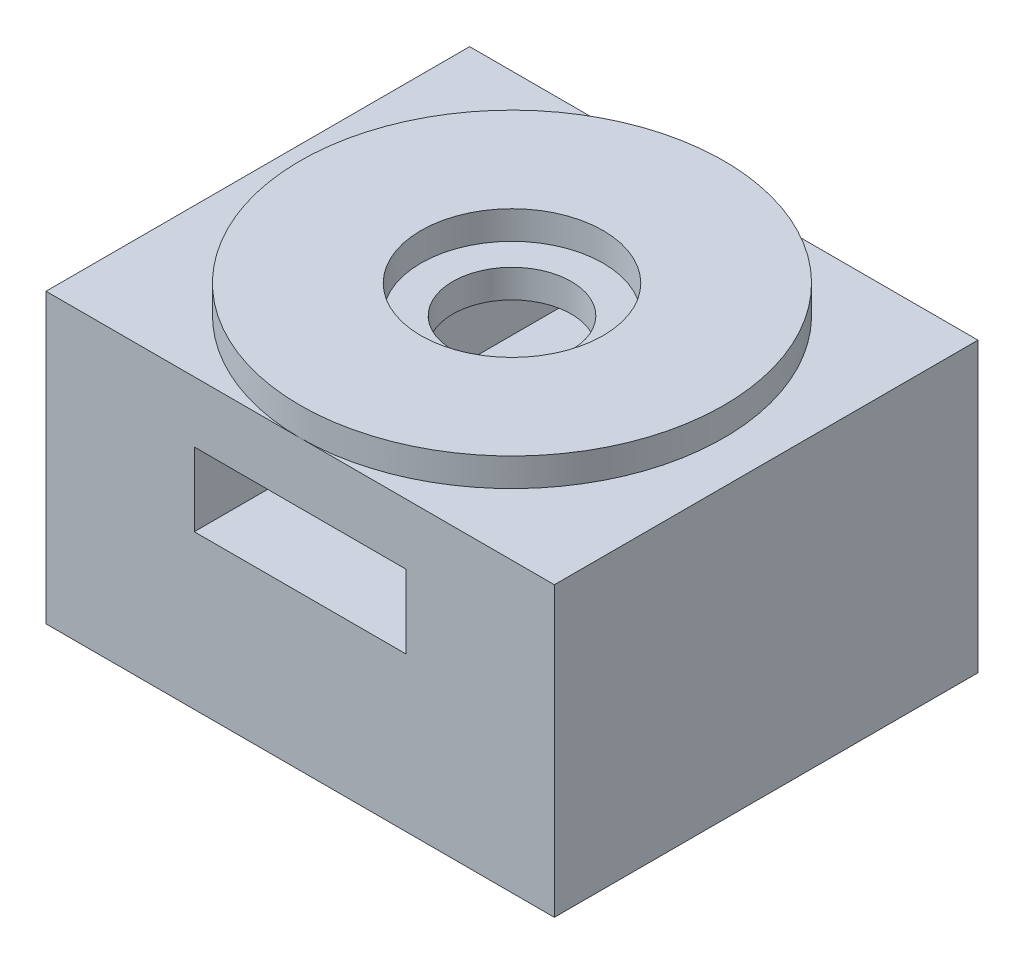
ISO-10303-21;
HEADER;
FILE_DESCRIPTION(('STEP AP214'),'2;1');
FILE_NAME('part.step','',(''),(''),'','','');
FILE_SCHEMA(('AUTOMOTIVE_DESIGN { 1 0 10303 214 1 1 1 1 }'));
ENDSEC;
DATA;
#1=APPLICATION_CONTEXT('core data for automotive mechanical design processes');
#2=APPLICATION_PROTOCOL_DEFINITION('international standard','automotive_design',2000,#1);
#3=PRODUCT_CONTEXT('',#1,'mechanical');
#4=PRODUCT('Part','Part','',(#3));
#5=PRODUCT_RELATED_PRODUCT_CATEGORY('part','',(#4));
#6=PRODUCT_DEFINITION_FORMATION('','',#4);
#7=PRODUCT_DEFINITION_CONTEXT('part definition',#1,'design');
#8=PRODUCT_DEFINITION('design','',#6,#7);
#9=PRODUCT_DEFINITION_SHAPE('','',#8);
#10=(LENGTH_UNIT() NAMED_UNIT(*) SI_UNIT(.MILLI.,.METRE.));
#11=(NAMED_UNIT(*) PLANE_ANGLE_UNIT() SI_UNIT($,.RADIAN.));
#12=(NAMED_UNIT(*) SI_UNIT($,.STERADIAN.) SOLID_ANGLE_UNIT());
#13=UNCERTAINTY_MEASURE_WITH_UNIT(LENGTH_MEASURE(1.E-05),#10,'distance_accuracy_value','');
#14=(GEOMETRIC_REPRESENTATION_CONTEXT(3) GLOBAL_UNCERTAINTY_ASSIGNED_CONTEXT((#13)) GLOBAL_UNIT_ASSIGNED_CONTEXT((#10,
#11,#12)) REPRESENTATION_CONTEXT('',''));
#15=CARTESIAN_POINT('',(0.,0.,0.));
#16=DIRECTION('',(0.,0.,1.));
#17=DIRECTION('',(1.,0.,0.));
#18=AXIS2_PLACEMENT_3D('',#15,#16,#17);
#19=CARTESIAN_POINT('',(-3.4,-15.003534722512,-3.6));
#20=DIRECTION('',(-1.,0.,0.));
#21=DIRECTION('',(0.,0.,1.));
#22=AXIS2_PLACEMENT_3D('',#19,#20,#21);
#23=PLANE('',#22);
#24=DIRECTION('',(0.,1.,0.));
#25=VECTOR('',#24,1.);
#26=CARTESIAN_POINT('',(-3.4,-15.003534722512,3.6));
#27=LINE('',#26,#25);
#28=CARTESIAN_POINT('',(-3.4,2.95,3.6));
#29=VERTEX_POINT('',#28);
#30=CARTESIAN_POINT('',(-3.4,4.1,3.6));
#31=VERTEX_POINT('',#30);
#32=EDGE_CURVE('E387',#29,#31,#27,.T.);
#33=ORIENTED_EDGE('',*,*,#32,.F.);
#34=DIRECTION('',(0.,0.,-1.));
#35=VECTOR('',#34,1.);
#36=CARTESIAN_POINT('',(-3.4,2.95,-3.6));
#37=LINE('',#36,#35);
#38=CARTESIAN_POINT('',(-3.4,2.95,3.52845575287547));
#39=VERTEX_POINT('',#38);
#40=EDGE_CURVE('E286',#29,#39,#37,.T.);
#41=ORIENTED_EDGE('',*,*,#40,.T.);
#42=DIRECTION('',(0.,1.,0.));
#43=VECTOR('',#42,1.);
#44=CARTESIAN_POINT('',(-3.4,-14.2592929112563,3.52845575287547));
#45=LINE('',#44,#43);
#46=CARTESIAN_POINT('',(-3.4,4.1,3.52845575287547));
#47=VERTEX_POINT('',#46);
#48=EDGE_CURVE('E331',#47,#39,#45,.F.);
#49=ORIENTED_EDGE('',*,*,#48,.F.);
#50=DIRECTION('',(0.,0.,1.));
#51=VECTOR('',#50,1.);
#52=CARTESIAN_POINT('',(-3.4,4.1,-3.6));
#53=LINE('',#52,#51);
#54=EDGE_CURVE('E383',#47,#31,#53,.T.);
#55=ORIENTED_EDGE('',*,*,#54,.T.);
#56=EDGE_LOOP('',(#33,#41,#49,#55));
#57=FACE_BOUND('',#56,.T.);
#58=ADVANCED_FACE('F35',(#57),#23,.F.);
#59=CARTESIAN_POINT('',(3.4,-15.003534722512,-3.6));
#60=DIRECTION('',(1.,0.,0.));
#61=DIRECTION('',(0.,0.,-1.));
#62=AXIS2_PLACEMENT_3D('',#59,#60,#61);
#63=PLANE('',#62);
#64=DIRECTION('',(0.,1.,0.));
#65=VECTOR('',#64,1.);
#66=CARTESIAN_POINT('',(3.4,-14.2592929112563,3.52845575287547));
#67=LINE('',#66,#65);
#68=CARTESIAN_POINT('',(3.4,2.95,3.52845575287547));
#69=VERTEX_POINT('',#68);
#70=CARTESIAN_POINT('',(3.4,4.1,3.52845575287547));
#71=VERTEX_POINT('',#70);
#72=EDGE_CURVE('E326',#69,#71,#67,.T.);
#73=ORIENTED_EDGE('',*,*,#72,.F.);
#74=DIRECTION('',(0.,0.,1.));
#75=VECTOR('',#74,1.);
#76=CARTESIAN_POINT('',(3.4,2.95,-3.6));
#77=LINE('',#76,#75);
#78=CARTESIAN_POINT('',(3.4,2.95,3.6));
#79=VERTEX_POINT('',#78);
#80=EDGE_CURVE('E283',#69,#79,#77,.T.);
#81=ORIENTED_EDGE('',*,*,#80,.T.);
#82=DIRECTION('',(0.,1.,0.));
#83=VECTOR('',#82,1.);
#84=CARTESIAN_POINT('',(3.4,-15.003534722512,3.6));
#85=LINE('',#84,#83);
#86=CARTESIAN_POINT('',(3.4,4.1,3.6));
#87=VERTEX_POINT('',#86);
#88=EDGE_CURVE('E412',#79,#87,#85,.T.);
#89=ORIENTED_EDGE('',*,*,#88,.T.);
#90=DIRECTION('',(0.,0.,-1.));
#91=VECTOR('',#90,1.);
#92=CARTESIAN_POINT('',(3.4,4.1,-3.6));
#93=LINE('',#92,#91);
#94=EDGE_CURVE('E384',#87,#71,#93,.T.);
#95=ORIENTED_EDGE('',*,*,#94,.T.);
#96=EDGE_LOOP('',(#73,#81,#89,#95));
#97=FACE_BOUND('',#96,.T.);
#98=ADVANCED_FACE('F554',(#97),#63,.F.);
#99=CARTESIAN_POINT('',(-3.4,-15.003534722512,3.6));
#100=DIRECTION('',(0.,0.,1.));
#101=DIRECTION('',(1.,0.,0.));
#102=AXIS2_PLACEMENT_3D('',#99,#100,#101);
#103=PLANE('',#102);
#104=DIRECTION('',(0.,1.,0.));
#105=VECTOR('',#104,1.);
#106=CARTESIAN_POINT('',(-3.32415402771893,-14.2592929112563,3.6));
#107=LINE('',#106,#105);
#108=CARTESIAN_POINT('',(-3.32415402771893,2.95,3.6));
#109=VERTEX_POINT('',#108);
#110=CARTESIAN_POINT('',(-3.32415402771893,4.1,3.6));
#111=VERTEX_POINT('',#110);
#112=EDGE_CURVE('E318',#109,#111,#107,.T.);
#113=ORIENTED_EDGE('',*,*,#112,.F.);
#114=DIRECTION('',(-1.,0.,0.));
#115=VECTOR('',#114,1.);
#116=CARTESIAN_POINT('',(-3.4,2.95,3.6));
#117=LINE('',#116,#115);
#118=EDGE_CURVE('E279',#109,#29,#117,.T.);
#119=ORIENTED_EDGE('',*,*,#118,.T.);
#120=ORIENTED_EDGE('',*,*,#32,.T.);
#121=DIRECTION('',(1.,0.,0.));
#122=VECTOR('',#121,1.);
#123=CARTESIAN_POINT('',(-3.4,4.1,3.6));
#124=LINE('',#123,#122);
#125=EDGE_CURVE('E388',#31,#111,#124,.T.);
#126=ORIENTED_EDGE('',*,*,#125,.T.);
#127=EDGE_LOOP('',(#113,#119,#120,#126));
#128=FACE_BOUND('',#127,.T.);
#129=ADVANCED_FACE('F552',(#128),#103,.F.);
#130=ORIENTED_EDGE('',*,*,#88,.F.);
#131=CARTESIAN_POINT('',(3.32415402771893,2.95,3.6));
#132=VERTEX_POINT('',#131);
#133=EDGE_CURVE('E282',#79,#132,#117,.T.);
#134=ORIENTED_EDGE('',*,*,#133,.T.);
#135=DIRECTION('',(0.,1.,0.));
#136=VECTOR('',#135,1.);
#137=CARTESIAN_POINT('',(3.32415402771893,-14.2592929112563,3.6));
#138=LINE('',#137,#136);
#139=CARTESIAN_POINT('',(3.32415402771893,4.1,3.6));
#140=VERTEX_POINT('',#139);
#141=EDGE_CURVE('E323',#140,#132,#138,.F.);
#142=ORIENTED_EDGE('',*,*,#141,.F.);
#143=EDGE_CURVE('E391',#140,#87,#124,.T.);
#144=ORIENTED_EDGE('',*,*,#143,.T.);
#145=EDGE_LOOP('',(#130,#134,#142,#144));
#146=FACE_BOUND('',#145,.T.);
#147=ADVANCED_FACE('F486',(#146),#103,.F.);
#148=CARTESIAN_POINT('',(0.,-14.2592929112563,0.));
#149=DIRECTION('',(0.,1.,0.));
#150=DIRECTION('',(0.,0.,1.));
#151=AXIS2_PLACEMENT_3D('',#148,#149,#150);
#152=CYLINDRICAL_SURFACE('',#151,4.9);
#153=CARTESIAN_POINT('',(0.,2.95,0.));
#154=DIRECTION('',(0.,1.,0.));
#155=DIRECTION('',(-1.,0.,0.));
#156=AXIS2_PLACEMENT_3D('',#153,#154,#155);
#157=CIRCLE('',#156,4.9);
#158=EDGE_CURVE('E476',#109,#132,#157,.T.);
#159=ORIENTED_EDGE('',*,*,#158,.F.);
#160=ORIENTED_EDGE('',*,*,#112,.T.);
#161=CARTESIAN_POINT('',(0.,4.1,0.));
#162=DIRECTION('',(0.,-1.,0.));
#163=DIRECTION('',(0.,0.,-1.));
#164=AXIS2_PLACEMENT_3D('',#161,#162,#163);
#165=CIRCLE('',#164,4.9);
#166=EDGE_CURVE('E311',#140,#111,#165,.T.);
#167=ORIENTED_EDGE('',*,*,#166,.F.);
#168=ORIENTED_EDGE('',*,*,#141,.T.);
#169=EDGE_LOOP('',(#159,#160,#167,#168));
#170=FACE_BOUND('',#169,.T.);
#171=ADVANCED_FACE('F489',(#170),#152,.F.);
#172=CARTESIAN_POINT('',(0.,5.1,0.));
#173=DIRECTION('',(0.,1.,0.));
#174=DIRECTION('',(0.,0.,1.));
#175=AXIS2_PLACEMENT_3D('',#172,#173,#174);
#176=PLANE('',#175);
#177=CARTESIAN_POINT('',(0.,5.1,0.));
#178=DIRECTION('',(0.,1.,0.));
#179=DIRECTION('',(0.,0.,1.));
#180=AXIS2_PLACEMENT_3D('',#177,#178,#179);
#181=CIRCLE('',#180,7.5);
#182=CARTESIAN_POINT('',(0.,5.1,7.5));
#183=VERTEX_POINT('',#182);
#184=CARTESIAN_POINT('',(0.,5.1,-7.5));
#185=VERTEX_POINT('',#184);
#186=EDGE_CURVE('E297',#183,#185,#181,.T.);
#187=ORIENTED_EDGE('',*,*,#186,.F.);
#188=DIRECTION('',(1.,0.,0.));
#189=VECTOR('',#188,1.);
#190=CARTESIAN_POINT('',(-9.,5.1,7.5));
#191=LINE('',#190,#189);
#192=CARTESIAN_POINT('',(9.,5.1,7.5));
#193=VERTEX_POINT('',#192);
#194=EDGE_CURVE('E425',#183,#193,#191,.T.);
#195=ORIENTED_EDGE('',*,*,#194,.T.);
#196=DIRECTION('',(0.,0.,-1.));
#197=VECTOR('',#196,1.);
#198=CARTESIAN_POINT('',(9.,5.1,-7.5));
#199=LINE('',#198,#197);
#200=CARTESIAN_POINT('',(9.,5.1,-7.5));
#201=VERTEX_POINT('',#200);
#202=EDGE_CURVE('E428',#193,#201,#199,.T.);
#203=ORIENTED_EDGE('',*,*,#202,.T.);
#204=DIRECTION('',(-1.,0.,0.));
#205=VECTOR('',#204,1.);
#206=CARTESIAN_POINT('',(-9.,5.1,-7.5));
#207=LINE('',#206,#205);
#208=EDGE_CURVE('E432',#201,#185,#207,.T.);
#209=ORIENTED_EDGE('',*,*,#208,.T.);
#210=EDGE_LOOP('',(#187,#195,#203,#209));
#211=FACE_BOUND('',#210,.T.);
#212=ADVANCED_FACE('F577',(#211),#176,.T.);
#213=CARTESIAN_POINT('',(0.,5.1,0.));
#214=DIRECTION('',(0.,1.,0.));
#215=DIRECTION('',(0.,0.,1.));
#216=AXIS2_PLACEMENT_3D('',#213,#214,#215);
#217=CIRCLE('',#216,2.1);
#218=CARTESIAN_POINT('',(0.,5.1,2.10000000000001));
#219=VERTEX_POINT('',#218);
#220=EDGE_CURVE('E418',#219,#219,#217,.T.);
#221=ORIENTED_EDGE('',*,*,#220,.F.);
#222=EDGE_LOOP('',(#221));
#223=FACE_BOUND('',#222,.T.);
#224=CARTESIAN_POINT('',(0.,5.1,0.));
#225=DIRECTION('',(0.,1.,0.));
#226=DIRECTION('',(0.,0.,1.));
#227=AXIS2_PLACEMENT_3D('',#224,#225,#226);
#228=CIRCLE('',#227,3.225);
#229=CARTESIAN_POINT('',(0.,5.1,3.225));
#230=VERTEX_POINT('',#229);
#231=EDGE_CURVE('E293',#230,#230,#228,.T.);
#232=ORIENTED_EDGE('',*,*,#231,.T.);
#233=EDGE_LOOP('',(#232));
#234=FACE_BOUND('',#233,.T.);
#235=ADVANCED_FACE('F571',(#223,#234),#176,.T.);
#236=CARTESIAN_POINT('',(-3.4,0.35,3.52845575287547));
#237=VERTEX_POINT('',#236);
#238=CARTESIAN_POINT('',(-3.4,-0.400000000000001,3.52845575287547));
#239=VERTEX_POINT('',#238);
#240=EDGE_CURVE('E330',#237,#239,#45,.F.);
#241=ORIENTED_EDGE('',*,*,#240,.F.);
#242=DIRECTION('',(0.,0.,1.));
#243=VECTOR('',#242,1.);
#244=CARTESIAN_POINT('',(-3.4,0.35,-3.6));
#245=LINE('',#244,#243);
#246=CARTESIAN_POINT('',(-3.4,0.35,3.6));
#247=VERTEX_POINT('',#246);
#248=EDGE_CURVE('E272',#237,#247,#245,.T.);
#249=ORIENTED_EDGE('',*,*,#248,.T.);
#250=CARTESIAN_POINT('',(-3.4,-4.1,3.6));
#251=VERTEX_POINT('',#250);
#252=EDGE_CURVE('E413',#251,#247,#27,.T.);
#253=ORIENTED_EDGE('',*,*,#252,.F.);
#254=DIRECTION('',(0.,0.,-1.));
#255=VECTOR('',#254,1.);
#256=CARTESIAN_POINT('',(-3.4,-4.1,-3.6));
#257=LINE('',#256,#255);
#258=CARTESIAN_POINT('',(-3.4,-4.1,-3.6));
#259=VERTEX_POINT('',#258);
#260=EDGE_CURVE('E401',#251,#259,#257,.T.);
#261=ORIENTED_EDGE('',*,*,#260,.T.);
#262=DIRECTION('',(0.,1.,0.));
#263=VECTOR('',#262,1.);
#264=CARTESIAN_POINT('',(-3.4,-15.003534722512,-3.6));
#265=LINE('',#264,#263);
#266=CARTESIAN_POINT('',(-3.4,-0.399999999999998,-3.6));
#267=VERTEX_POINT('',#266);
#268=EDGE_CURVE('E397',#259,#267,#265,.T.);
#269=ORIENTED_EDGE('',*,*,#268,.T.);
#270=DIRECTION('',(0.,0.,1.));
#271=VECTOR('',#270,1.);
#272=CARTESIAN_POINT('',(-3.4,-0.399999999999998,-3.6));
#273=LINE('',#272,#271);
#274=EDGE_CURVE('E380',#267,#239,#273,.T.);
#275=ORIENTED_EDGE('',*,*,#274,.T.);
#276=EDGE_LOOP('',(#241,#249,#253,#261,#269,#275));
#277=FACE_BOUND('',#276,.T.);
#278=ADVANCED_FACE('F541',(#277),#23,.F.);
#279=CARTESIAN_POINT('',(3.4,-4.1,3.6));
#280=VERTEX_POINT('',#279);
#281=CARTESIAN_POINT('',(3.4,0.35,3.6));
#282=VERTEX_POINT('',#281);
#283=EDGE_CURVE('E409',#280,#282,#85,.T.);
#284=ORIENTED_EDGE('',*,*,#283,.T.);
#285=DIRECTION('',(0.,0.,-1.));
#286=VECTOR('',#285,1.);
#287=CARTESIAN_POINT('',(3.4,0.350000000000001,-3.6));
#288=LINE('',#287,#286);
#289=CARTESIAN_POINT('',(3.4,0.350000000000001,3.52845575287547));
#290=VERTEX_POINT('',#289);
#291=EDGE_CURVE('E269',#282,#290,#288,.T.);
#292=ORIENTED_EDGE('',*,*,#291,.T.);
#293=CARTESIAN_POINT('',(3.4,-0.400000000000001,3.52845575287547));
#294=VERTEX_POINT('',#293);
#295=EDGE_CURVE('E327',#294,#290,#67,.T.);
#296=ORIENTED_EDGE('',*,*,#295,.F.);
#297=DIRECTION('',(0.,0.,-1.));
#298=VECTOR('',#297,1.);
#299=CARTESIAN_POINT('',(3.4,-0.400000000000001,-3.6));
#300=LINE('',#299,#298);
#301=CARTESIAN_POINT('',(3.4,-0.400000000000001,-3.6));
#302=VERTEX_POINT('',#301);
#303=EDGE_CURVE('E454',#294,#302,#300,.T.);
#304=ORIENTED_EDGE('',*,*,#303,.T.);
#305=DIRECTION('',(0.,1.,0.));
#306=VECTOR('',#305,1.);
#307=CARTESIAN_POINT('',(3.4,-15.003534722512,-3.6));
#308=LINE('',#307,#306);
#309=CARTESIAN_POINT('',(3.4,-4.1,-3.6));
#310=VERTEX_POINT('',#309);
#311=EDGE_CURVE('E406',#310,#302,#308,.T.);
#312=ORIENTED_EDGE('',*,*,#311,.F.);
#313=DIRECTION('',(0.,0.,1.));
#314=VECTOR('',#313,1.);
#315=CARTESIAN_POINT('',(3.4,-4.1,-3.6));
#316=LINE('',#315,#314);
#317=EDGE_CURVE('E394',#310,#280,#316,.T.);
#318=ORIENTED_EDGE('',*,*,#317,.T.);
#319=EDGE_LOOP('',(#284,#292,#296,#304,#312,#318));
#320=FACE_BOUND('',#319,.T.);
#321=ADVANCED_FACE('F562',(#320),#63,.F.);
#322=ORIENTED_EDGE('',*,*,#252,.T.);
#323=DIRECTION('',(1.,0.,0.));
#324=VECTOR('',#323,1.);
#325=CARTESIAN_POINT('',(-3.4,0.35,3.6));
#326=LINE('',#325,#324);
#327=CARTESIAN_POINT('',(-3.32415402771893,0.349999999999999,3.6));
#328=VERTEX_POINT('',#327);
#329=EDGE_CURVE('E268',#247,#328,#326,.T.);
#330=ORIENTED_EDGE('',*,*,#329,.T.);
#331=CARTESIAN_POINT('',(-3.32415402771893,-0.400000000000001,3.6));
#332=VERTEX_POINT('',#331);
#333=EDGE_CURVE('E319',#332,#328,#107,.T.);
#334=ORIENTED_EDGE('',*,*,#333,.F.);
#335=DIRECTION('',(1.,0.,0.));
#336=VECTOR('',#335,1.);
#337=CARTESIAN_POINT('',(-3.4,-0.400000000000001,3.6));
#338=LINE('',#337,#336);
#339=CARTESIAN_POINT('',(3.32415402771893,-0.400000000000001,3.6));
#340=VERTEX_POINT('',#339);
#341=EDGE_CURVE('E315',#332,#340,#338,.T.);
#342=ORIENTED_EDGE('',*,*,#341,.T.);
#343=CARTESIAN_POINT('',(3.32415402771893,0.35,3.6));
#344=VERTEX_POINT('',#343);
#345=EDGE_CURVE('E322',#344,#340,#138,.F.);
#346=ORIENTED_EDGE('',*,*,#345,.F.);
#347=EDGE_CURVE('E58',#344,#282,#326,.T.);
#348=ORIENTED_EDGE('',*,*,#347,.T.);
#349=ORIENTED_EDGE('',*,*,#283,.F.);
#350=DIRECTION('',(-1.,0.,0.));
#351=VECTOR('',#350,1.);
#352=CARTESIAN_POINT('',(-3.4,-4.1,3.6));
#353=LINE('',#352,#351);
#354=EDGE_CURVE('E403',#280,#251,#353,.T.);
#355=ORIENTED_EDGE('',*,*,#354,.T.);
#356=EDGE_LOOP('',(#322,#330,#334,#342,#346,#348,#349,#355));
#357=FACE_BOUND('',#356,.T.);
#358=ADVANCED_FACE('F536',(#357),#103,.F.);
#359=CARTESIAN_POINT('',(-3.4,-15.003534722512,-3.6));
#360=DIRECTION('',(0.,0.,-1.));
#361=DIRECTION('',(-1.,0.,0.));
#362=AXIS2_PLACEMENT_3D('',#359,#360,#361);
#363=PLANE('',#362);
#364=DIRECTION('',(0.,1.,0.));
#365=VECTOR('',#364,1.);
#366=CARTESIAN_POINT('',(-1.75,-15.003534722512,-3.6));
#367=LINE('',#366,#365);
#368=CARTESIAN_POINT('',(-1.75,-4.1,-3.6));
#369=VERTEX_POINT('',#368);
#370=CARTESIAN_POINT('',(-1.75,-0.4,-3.6));
#371=VERTEX_POINT('',#370);
#372=EDGE_CURVE('E469',#369,#371,#367,.T.);
#373=ORIENTED_EDGE('',*,*,#372,.T.);
#374=DIRECTION('',(-1.,0.,0.));
#375=VECTOR('',#374,1.);
#376=CARTESIAN_POINT('',(-3.39999999999999,-0.399999999999998,-3.6));
#377=LINE('',#376,#375);
#378=EDGE_CURVE('E472',#371,#267,#377,.T.);
#379=ORIENTED_EDGE('',*,*,#378,.T.);
#380=ORIENTED_EDGE('',*,*,#268,.F.);
#381=DIRECTION('',(1.,0.,0.));
#382=VECTOR('',#381,1.);
#383=CARTESIAN_POINT('',(-3.4,-4.1,-3.6));
#384=LINE('',#383,#382);
#385=EDGE_CURVE('E398',#259,#369,#384,.T.);
#386=ORIENTED_EDGE('',*,*,#385,.T.);
#387=EDGE_LOOP('',(#373,#379,#380,#386));
#388=FACE_BOUND('',#387,.T.);
#389=ADVANCED_FACE('F565',(#388),#363,.F.);
#390=CARTESIAN_POINT('',(0.,-5.1,0.));
#391=DIRECTION('',(0.,1.,0.));
#392=DIRECTION('',(0.,0.,1.));
#393=AXIS2_PLACEMENT_3D('',#390,#391,#392);
#394=CYLINDRICAL_SURFACE('',#393,2.1);
#395=CARTESIAN_POINT('',(0.,-5.1,0.));
#396=DIRECTION('',(0.,1.,0.));
#397=DIRECTION('',(0.,0.,1.));
#398=AXIS2_PLACEMENT_3D('',#395,#396,#397);
#399=CIRCLE('',#398,2.1);
#400=CARTESIAN_POINT('',(0.,-5.1,2.10000000000001));
#401=VERTEX_POINT('',#400);
#402=EDGE_CURVE('E435',#401,#401,#399,.T.);
#403=ORIENTED_EDGE('',*,*,#402,.F.);
#404=EDGE_LOOP('',(#403));
#405=FACE_BOUND('',#404,.T.);
#406=CARTESIAN_POINT('',(0.,-4.1,0.));
#407=DIRECTION('',(0.,1.,0.));
#408=DIRECTION('',(0.,0.,1.));
#409=AXIS2_PLACEMENT_3D('',#406,#407,#408);
#410=CIRCLE('',#409,2.1);
#411=CARTESIAN_POINT('',(0.,-4.1,2.10000000000001));
#412=VERTEX_POINT('',#411);
#413=EDGE_CURVE('E422',#412,#412,#410,.F.);
#414=ORIENTED_EDGE('',*,*,#413,.F.);
#415=EDGE_LOOP('',(#414));
#416=FACE_BOUND('',#415,.T.);
#417=ADVANCED_FACE('F599',(#405,#416),#394,.F.);
#418=CARTESIAN_POINT('',(-9.,-5.1,-7.5));
#419=DIRECTION('',(-1.,0.,0.));
#420=DIRECTION('',(0.,0.,1.));
#421=AXIS2_PLACEMENT_3D('',#418,#419,#420);
#422=PLANE('',#421);
#423=DIRECTION('',(0.,1.,0.));
#424=VECTOR('',#423,1.);
#425=CARTESIAN_POINT('',(-9.,-5.1,7.5));
#426=LINE('',#425,#424);
#427=CARTESIAN_POINT('',(-9.,-5.1,7.5));
#428=VERTEX_POINT('',#427);
#429=CARTESIAN_POINT('',(-9.,5.1,7.5));
#430=VERTEX_POINT('',#429);
#431=EDGE_CURVE('E450',#428,#430,#426,.T.);
#432=ORIENTED_EDGE('',*,*,#431,.T.);
#433=DIRECTION('',(0.,0.,1.));
#434=VECTOR('',#433,1.);
#435=CARTESIAN_POINT('',(-9.,5.1,-7.5));
#436=LINE('',#435,#434);
#437=CARTESIAN_POINT('',(-9.,5.1,-7.5));
#438=VERTEX_POINT('',#437);
#439=EDGE_CURVE('E421',#438,#430,#436,.T.);
#440=ORIENTED_EDGE('',*,*,#439,.F.);
#441=DIRECTION('',(0.,1.,0.));
#442=VECTOR('',#441,1.);
#443=CARTESIAN_POINT('',(-9.,-5.1,-7.5));
#444=LINE('',#443,#442);
#445=CARTESIAN_POINT('',(-9.,-5.1,-7.5));
#446=VERTEX_POINT('',#445);
#447=EDGE_CURVE('E451',#446,#438,#444,.T.);
#448=ORIENTED_EDGE('',*,*,#447,.F.);
#449=DIRECTION('',(0.,0.,1.));
#450=VECTOR('',#449,1.);
#451=CARTESIAN_POINT('',(-9.,-5.1,-7.5));
#452=LINE('',#451,#450);
#453=EDGE_CURVE('E438',#446,#428,#452,.T.);
#454=ORIENTED_EDGE('',*,*,#453,.T.);
#455=EDGE_LOOP('',(#432,#440,#448,#454));
#456=FACE_BOUND('',#455,.T.);
#457=ADVANCED_FACE('F37',(#456),#422,.T.);
#458=CARTESIAN_POINT('',(-9.,-5.1,-7.5));
#459=DIRECTION('',(0.,0.,-1.));
#460=DIRECTION('',(-1.,0.,0.));
#461=AXIS2_PLACEMENT_3D('',#458,#459,#460);
#462=PLANE('',#461);
#463=DIRECTION('',(-1.,0.,0.));
#464=VECTOR('',#463,1.);
#465=CARTESIAN_POINT('',(4.9,-0.4,-7.5));
#466=LINE('',#465,#464);
#467=CARTESIAN_POINT('',(4.9,-0.4,-7.5));
#468=VERTEX_POINT('',#467);
#469=CARTESIAN_POINT('',(1.75,-0.4,-7.5));
#470=VERTEX_POINT('',#469);
#471=EDGE_CURVE('E334',#468,#470,#466,.T.);
#472=ORIENTED_EDGE('',*,*,#471,.F.);
#473=DIRECTION('',(0.,-1.,0.));
#474=VECTOR('',#473,1.);
#475=CARTESIAN_POINT('',(4.9,4.1,-7.5));
#476=LINE('',#475,#474);
#477=CARTESIAN_POINT('',(4.9,4.1,-7.5));
#478=VERTEX_POINT('',#477);
#479=EDGE_CURVE('E338',#478,#468,#476,.T.);
#480=ORIENTED_EDGE('',*,*,#479,.F.);
#481=DIRECTION('',(1.,0.,0.));
#482=VECTOR('',#481,1.);
#483=CARTESIAN_POINT('',(4.9,4.1,-7.5));
#484=LINE('',#483,#482);
#485=CARTESIAN_POINT('',(-4.9,4.1,-7.5));
#486=VERTEX_POINT('',#485);
#487=EDGE_CURVE('E358',#486,#478,#484,.T.);
#488=ORIENTED_EDGE('',*,*,#487,.F.);
#489=DIRECTION('',(0.,1.,0.));
#490=VECTOR('',#489,1.);
#491=CARTESIAN_POINT('',(-4.9,4.1,-7.5));
#492=LINE('',#491,#490);
#493=CARTESIAN_POINT('',(-4.9,-0.399999999999998,-7.5));
#494=VERTEX_POINT('',#493);
#495=EDGE_CURVE('E355',#494,#486,#492,.T.);
#496=ORIENTED_EDGE('',*,*,#495,.F.);
#497=DIRECTION('',(-1.,0.,0.));
#498=VECTOR('',#497,1.);
#499=CARTESIAN_POINT('',(-1.75,-0.4,-7.5));
#500=LINE('',#499,#498);
#501=CARTESIAN_POINT('',(-1.75,-0.4,-7.5));
#502=VERTEX_POINT('',#501);
#503=EDGE_CURVE('E352',#502,#494,#500,.T.);
#504=ORIENTED_EDGE('',*,*,#503,.F.);
#505=DIRECTION('',(0.,1.,0.));
#506=VECTOR('',#505,1.);
#507=CARTESIAN_POINT('',(-1.75,-0.4,-7.5));
#508=LINE('',#507,#506);
#509=CARTESIAN_POINT('',(-1.75,-4.1,-7.5));
#510=VERTEX_POINT('',#509);
#511=EDGE_CURVE('E349',#510,#502,#508,.T.);
#512=ORIENTED_EDGE('',*,*,#511,.F.);
#513=DIRECTION('',(-1.,0.,0.));
#514=VECTOR('',#513,1.);
#515=CARTESIAN_POINT('',(1.75,-4.1,-7.5));
#516=LINE('',#515,#514);
#517=CARTESIAN_POINT('',(1.75,-4.1,-7.5));
#518=VERTEX_POINT('',#517);
#519=EDGE_CURVE('E346',#518,#510,#516,.T.);
#520=ORIENTED_EDGE('',*,*,#519,.F.);
#521=DIRECTION('',(0.,-1.,0.));
#522=VECTOR('',#521,1.);
#523=CARTESIAN_POINT('',(1.75,-4.1,-7.5));
#524=LINE('',#523,#522);
#525=EDGE_CURVE('E343',#470,#518,#524,.T.);
#526=ORIENTED_EDGE('',*,*,#525,.F.);
#527=EDGE_LOOP('',(#472,#480,#488,#496,#504,#512,#520,#526));
#528=FACE_BOUND('',#527,.T.);
#529=ORIENTED_EDGE('',*,*,#447,.T.);
#530=EDGE_CURVE('E431',#185,#438,#207,.T.);
#531=ORIENTED_EDGE('',*,*,#530,.F.);
#532=ORIENTED_EDGE('',*,*,#208,.F.);
#533=DIRECTION('',(0.,1.,0.));
#534=VECTOR('',#533,1.);
#535=CARTESIAN_POINT('',(9.,-5.1,-7.5));
#536=LINE('',#535,#534);
#537=CARTESIAN_POINT('',(9.,-5.1,-7.5));
#538=VERTEX_POINT('',#537);
#539=EDGE_CURVE('E455',#538,#201,#536,.T.);
#540=ORIENTED_EDGE('',*,*,#539,.F.);
#541=DIRECTION('',(-1.,0.,0.));
#542=VECTOR('',#541,1.);
#543=CARTESIAN_POINT('',(-9.,-5.1,-7.5));
#544=LINE('',#543,#542);
#545=EDGE_CURVE('E447',#538,#446,#544,.T.);
#546=ORIENTED_EDGE('',*,*,#545,.T.);
#547=EDGE_LOOP('',(#529,#531,#532,#540,#546));
#548=FACE_BOUND('',#547,.T.);
#549=ADVANCED_FACE('F510',(#528,#548),#462,.T.);
#550=CARTESIAN_POINT('',(9.,-5.1,-7.5));
#551=DIRECTION('',(1.,0.,0.));
#552=DIRECTION('',(0.,0.,-1.));
#553=AXIS2_PLACEMENT_3D('',#550,#551,#552);
#554=PLANE('',#553);
#555=ORIENTED_EDGE('',*,*,#539,.T.);
#556=ORIENTED_EDGE('',*,*,#202,.F.);
#557=DIRECTION('',(0.,1.,0.));
#558=VECTOR('',#557,1.);
#559=CARTESIAN_POINT('',(9.,-5.1,7.5));
#560=LINE('',#559,#558);
#561=CARTESIAN_POINT('',(9.,-5.1,7.5));
#562=VERTEX_POINT('',#561);
#563=EDGE_CURVE('E457',#562,#193,#560,.T.);
#564=ORIENTED_EDGE('',*,*,#563,.F.);
#565=DIRECTION('',(0.,0.,-1.));
#566=VECTOR('',#565,1.);
#567=CARTESIAN_POINT('',(9.,-5.1,-7.5));
#568=LINE('',#567,#566);
#569=EDGE_CURVE('E444',#562,#538,#568,.T.);
#570=ORIENTED_EDGE('',*,*,#569,.T.);
#571=EDGE_LOOP('',(#555,#556,#564,#570));
#572=FACE_BOUND('',#571,.T.);
#573=ADVANCED_FACE('F688',(#572),#554,.T.);
#574=CARTESIAN_POINT('',(-9.,-5.1,7.5));
#575=DIRECTION('',(0.,0.,1.));
#576=DIRECTION('',(1.,0.,0.));
#577=AXIS2_PLACEMENT_3D('',#574,#575,#576);
#578=PLANE('',#577);
#579=DIRECTION('',(0.,-1.,0.));
#580=VECTOR('',#579,1.);
#581=CARTESIAN_POINT('',(-3.75,2.95,7.5));
#582=LINE('',#581,#580);
#583=CARTESIAN_POINT('',(-3.75,2.95,7.5));
#584=VERTEX_POINT('',#583);
#585=CARTESIAN_POINT('',(-3.75,0.349999999999999,7.5));
#586=VERTEX_POINT('',#585);
#587=EDGE_CURVE('E50',#584,#586,#582,.T.);
#588=ORIENTED_EDGE('',*,*,#587,.F.);
#589=DIRECTION('',(-1.,0.,0.));
#590=VECTOR('',#589,1.);
#591=CARTESIAN_POINT('',(-3.75,2.95,7.5));
#592=LINE('',#591,#590);
#593=CARTESIAN_POINT('',(3.75,2.95,7.5));
#594=VERTEX_POINT('',#593);
#595=EDGE_CURVE('E258',#594,#584,#592,.T.);
#596=ORIENTED_EDGE('',*,*,#595,.F.);
#597=DIRECTION('',(0.,1.,0.));
#598=VECTOR('',#597,1.);
#599=CARTESIAN_POINT('',(3.75,2.95,7.5));
#600=LINE('',#599,#598);
#601=CARTESIAN_POINT('',(3.75,0.35,7.5));
#602=VERTEX_POINT('',#601);
#603=EDGE_CURVE('E243',#602,#594,#600,.T.);
#604=ORIENTED_EDGE('',*,*,#603,.F.);
#605=DIRECTION('',(1.,0.,0.));
#606=VECTOR('',#605,1.);
#607=CARTESIAN_POINT('',(-3.75,0.349999999999999,7.5));
#608=LINE('',#607,#606);
#609=EDGE_CURVE('E251',#586,#602,#608,.T.);
#610=ORIENTED_EDGE('',*,*,#609,.F.);
#611=EDGE_LOOP('',(#588,#596,#604,#610));
#612=FACE_BOUND('',#611,.T.);
#613=ORIENTED_EDGE('',*,*,#563,.T.);
#614=ORIENTED_EDGE('',*,*,#194,.F.);
#615=EDGE_CURVE('E426',#430,#183,#191,.T.);
#616=ORIENTED_EDGE('',*,*,#615,.F.);
#617=ORIENTED_EDGE('',*,*,#431,.F.);
#618=DIRECTION('',(1.,0.,0.));
#619=VECTOR('',#618,1.);
#620=CARTESIAN_POINT('',(-9.,-5.1,7.5));
#621=LINE('',#620,#619);
#622=EDGE_CURVE('E441',#428,#562,#621,.T.);
#623=ORIENTED_EDGE('',*,*,#622,.T.);
#624=EDGE_LOOP('',(#613,#614,#616,#617,#623));
#625=FACE_BOUND('',#624,.T.);
#626=ADVANCED_FACE('F255',(#612,#625),#578,.T.);
#627=CARTESIAN_POINT('',(0.,-5.1,0.));
#628=DIRECTION('',(0.,1.,0.));
#629=DIRECTION('',(0.,0.,1.));
#630=AXIS2_PLACEMENT_3D('',#627,#628,#629);
#631=PLANE('',#630);
#632=ORIENTED_EDGE('',*,*,#402,.T.);
#633=EDGE_LOOP('',(#632));
#634=FACE_BOUND('',#633,.T.);
#635=ORIENTED_EDGE('',*,*,#453,.F.);
#636=ORIENTED_EDGE('',*,*,#545,.F.);
#637=ORIENTED_EDGE('',*,*,#569,.F.);
#638=ORIENTED_EDGE('',*,*,#622,.F.);
#639=EDGE_LOOP('',(#635,#636,#637,#638));
#640=FACE_BOUND('',#639,.T.);
#641=ADVANCED_FACE('F597',(#634,#640),#631,.F.);
#642=CARTESIAN_POINT('',(0.,4.1,0.));
#643=DIRECTION('',(0.,1.,0.));
#644=DIRECTION('',(0.,0.,1.));
#645=AXIS2_PLACEMENT_3D('',#642,#643,#644);
#646=CIRCLE('',#645,2.1);
#647=CARTESIAN_POINT('',(0.,4.1,2.10000000000001));
#648=VERTEX_POINT('',#647);
#649=EDGE_CURVE('E417',#648,#648,#646,.F.);
#650=ORIENTED_EDGE('',*,*,#649,.T.);
#651=EDGE_LOOP('',(#650));
#652=FACE_BOUND('',#651,.T.);
#653=ORIENTED_EDGE('',*,*,#220,.T.);
#654=EDGE_LOOP('',(#653));
#655=FACE_BOUND('',#654,.T.);
#656=ADVANCED_FACE('F589',(#652,#655),#394,.F.);
#657=EDGE_CURVE('E306',#185,#183,#181,.T.);
#658=ORIENTED_EDGE('',*,*,#657,.F.);
#659=ORIENTED_EDGE('',*,*,#530,.T.);
#660=ORIENTED_EDGE('',*,*,#439,.T.);
#661=ORIENTED_EDGE('',*,*,#615,.T.);
#662=EDGE_LOOP('',(#658,#659,#660,#661));
#663=FACE_BOUND('',#662,.T.);
#664=ADVANCED_FACE('F579',(#663),#176,.T.);
#665=CARTESIAN_POINT('',(0.,-4.1,0.));
#666=DIRECTION('',(0.,1.,0.));
#667=DIRECTION('',(0.,0.,1.));
#668=AXIS2_PLACEMENT_3D('',#665,#666,#667);
#669=PLANE('',#668);
#670=ORIENTED_EDGE('',*,*,#413,.T.);
#671=EDGE_LOOP('',(#670));
#672=FACE_BOUND('',#671,.T.);
#673=DIRECTION('',(0.,0.,-1.));
#674=VECTOR('',#673,1.);
#675=CARTESIAN_POINT('',(-1.75,-4.1,0.));
#676=LINE('',#675,#674);
#677=EDGE_CURVE('E374',#369,#510,#676,.T.);
#678=ORIENTED_EDGE('',*,*,#677,.F.);
#679=ORIENTED_EDGE('',*,*,#385,.F.);
#680=ORIENTED_EDGE('',*,*,#260,.F.);
#681=ORIENTED_EDGE('',*,*,#354,.F.);
#682=ORIENTED_EDGE('',*,*,#317,.F.);
#683=CARTESIAN_POINT('',(1.75,-4.1,-3.6));
#684=VERTEX_POINT('',#683);
#685=EDGE_CURVE('E396',#684,#310,#384,.T.);
#686=ORIENTED_EDGE('',*,*,#685,.F.);
#687=DIRECTION('',(0.,0.,-1.));
#688=VECTOR('',#687,1.);
#689=CARTESIAN_POINT('',(1.75,-4.1,0.));
#690=LINE('',#689,#688);
#691=EDGE_CURVE('E376',#684,#518,#690,.T.);
#692=ORIENTED_EDGE('',*,*,#691,.T.);
#693=ORIENTED_EDGE('',*,*,#519,.T.);
#694=EDGE_LOOP('',(#678,#679,#680,#681,#682,#686,#692,#693));
#695=FACE_BOUND('',#694,.T.);
#696=ADVANCED_FACE('F588',(#672,#695),#669,.T.);
#697=CARTESIAN_POINT('',(0.,4.1,0.));
#698=DIRECTION('',(0.,1.,0.));
#699=DIRECTION('',(0.,0.,1.));
#700=AXIS2_PLACEMENT_3D('',#697,#698,#699);
#701=PLANE('',#700);
#702=ORIENTED_EDGE('',*,*,#143,.F.);
#703=ORIENTED_EDGE('',*,*,#166,.T.);
#704=ORIENTED_EDGE('',*,*,#125,.F.);
#705=ORIENTED_EDGE('',*,*,#54,.F.);
#706=CARTESIAN_POINT('',(-4.9,4.1,0.));
#707=VERTEX_POINT('',#706);
#708=EDGE_CURVE('E303',#47,#707,#165,.T.);
#709=ORIENTED_EDGE('',*,*,#708,.T.);
#710=DIRECTION('',(0.,0.,-1.));
#711=VECTOR('',#710,1.);
#712=CARTESIAN_POINT('',(-4.9,4.1,0.));
#713=LINE('',#712,#711);
#714=EDGE_CURVE('E368',#707,#486,#713,.T.);
#715=ORIENTED_EDGE('',*,*,#714,.T.);
#716=ORIENTED_EDGE('',*,*,#487,.T.);
#717=DIRECTION('',(0.,0.,-1.));
#718=VECTOR('',#717,1.);
#719=CARTESIAN_POINT('',(4.9,4.1,0.));
#720=LINE('',#719,#718);
#721=CARTESIAN_POINT('',(4.9,4.1,0.));
#722=VERTEX_POINT('',#721);
#723=EDGE_CURVE('E366',#722,#478,#720,.T.);
#724=ORIENTED_EDGE('',*,*,#723,.F.);
#725=EDGE_CURVE('E307',#722,#71,#165,.T.);
#726=ORIENTED_EDGE('',*,*,#725,.T.);
#727=ORIENTED_EDGE('',*,*,#94,.F.);
#728=EDGE_LOOP('',(#702,#703,#704,#705,#709,#715,#716,#724,#726,#727));
#729=FACE_BOUND('',#728,.T.);
#730=ORIENTED_EDGE('',*,*,#649,.F.);
#731=EDGE_LOOP('',(#730));
#732=FACE_BOUND('',#731,.T.);
#733=ADVANCED_FACE('F496',(#729,#732),#701,.F.);
#734=ORIENTED_EDGE('',*,*,#311,.T.);
#735=DIRECTION('',(-1.,0.,0.));
#736=VECTOR('',#735,1.);
#737=CARTESIAN_POINT('',(-3.4,-0.400000000000001,-3.6));
#738=LINE('',#737,#736);
#739=CARTESIAN_POINT('',(1.75,-0.4,-3.6));
#740=VERTEX_POINT('',#739);
#741=EDGE_CURVE('E365',#302,#740,#738,.T.);
#742=ORIENTED_EDGE('',*,*,#741,.T.);
#743=DIRECTION('',(0.,-1.,0.));
#744=VECTOR('',#743,1.);
#745=CARTESIAN_POINT('',(1.75,-15.003534722512,-3.6));
#746=LINE('',#745,#744);
#747=EDGE_CURVE('E466',#740,#684,#746,.T.);
#748=ORIENTED_EDGE('',*,*,#747,.T.);
#749=ORIENTED_EDGE('',*,*,#685,.T.);
#750=EDGE_LOOP('',(#734,#742,#748,#749));
#751=FACE_BOUND('',#750,.T.);
#752=ADVANCED_FACE('F636',(#751),#363,.F.);
#753=CARTESIAN_POINT('',(-1.75,-0.4,0.));
#754=DIRECTION('',(0.,-1.,0.));
#755=DIRECTION('',(1.,0.,0.));
#756=AXIS2_PLACEMENT_3D('',#753,#754,#755);
#757=PLANE('',#756);
#758=ORIENTED_EDGE('',*,*,#274,.F.);
#759=ORIENTED_EDGE('',*,*,#378,.F.);
#760=DIRECTION('',(0.,0.,-1.));
#761=VECTOR('',#760,1.);
#762=CARTESIAN_POINT('',(-1.75,-0.4,0.));
#763=LINE('',#762,#761);
#764=EDGE_CURVE('E372',#371,#502,#763,.T.);
#765=ORIENTED_EDGE('',*,*,#764,.T.);
#766=ORIENTED_EDGE('',*,*,#503,.T.);
#767=DIRECTION('',(0.,0.,-1.));
#768=VECTOR('',#767,1.);
#769=CARTESIAN_POINT('',(-4.9,-0.399999999999998,0.));
#770=LINE('',#769,#768);
#771=CARTESIAN_POINT('',(-4.9,-0.399999999999998,0.));
#772=VERTEX_POINT('',#771);
#773=EDGE_CURVE('E370',#772,#494,#770,.T.);
#774=ORIENTED_EDGE('',*,*,#773,.F.);
#775=CARTESIAN_POINT('',(0.,-0.400000000000001,0.));
#776=DIRECTION('',(0.,-1.,0.));
#777=DIRECTION('',(0.,0.,-1.));
#778=AXIS2_PLACEMENT_3D('',#775,#776,#777);
#779=CIRCLE('',#778,4.9);
#780=EDGE_CURVE('E310',#239,#772,#779,.T.);
#781=ORIENTED_EDGE('',*,*,#780,.F.);
#782=EDGE_LOOP('',(#758,#759,#765,#766,#774,#781));
#783=FACE_BOUND('',#782,.T.);
#784=ADVANCED_FACE('F632',(#783),#757,.F.);
#785=CARTESIAN_POINT('',(-1.75,-0.4,0.));
#786=DIRECTION('',(-1.,0.,0.));
#787=DIRECTION('',(0.,-1.,0.));
#788=AXIS2_PLACEMENT_3D('',#785,#786,#787);
#789=PLANE('',#788);
#790=ORIENTED_EDGE('',*,*,#677,.T.);
#791=ORIENTED_EDGE('',*,*,#511,.T.);
#792=ORIENTED_EDGE('',*,*,#764,.F.);
#793=ORIENTED_EDGE('',*,*,#372,.F.);
#794=EDGE_LOOP('',(#790,#791,#792,#793));
#795=FACE_BOUND('',#794,.T.);
#796=ADVANCED_FACE('F635',(#795),#789,.F.);
#797=CARTESIAN_POINT('',(1.75,-4.1,0.));
#798=DIRECTION('',(1.,0.,0.));
#799=DIRECTION('',(0.,0.,-1.));
#800=AXIS2_PLACEMENT_3D('',#797,#798,#799);
#801=PLANE('',#800);
#802=DIRECTION('',(0.,0.,-1.));
#803=VECTOR('',#802,1.);
#804=CARTESIAN_POINT('',(1.75,-0.4,0.));
#805=LINE('',#804,#803);
#806=EDGE_CURVE('E340',#740,#470,#805,.T.);
#807=ORIENTED_EDGE('',*,*,#806,.T.);
#808=ORIENTED_EDGE('',*,*,#525,.T.);
#809=ORIENTED_EDGE('',*,*,#691,.F.);
#810=ORIENTED_EDGE('',*,*,#747,.F.);
#811=EDGE_LOOP('',(#807,#808,#809,#810));
#812=FACE_BOUND('',#811,.T.);
#813=ADVANCED_FACE('F640',(#812),#801,.F.);
#814=CARTESIAN_POINT('',(4.9,-0.4,0.));
#815=DIRECTION('',(0.,-1.,0.));
#816=DIRECTION('',(0.,0.,-1.));
#817=AXIS2_PLACEMENT_3D('',#814,#815,#816);
#818=PLANE('',#817);
#819=ORIENTED_EDGE('',*,*,#741,.F.);
#820=ORIENTED_EDGE('',*,*,#303,.F.);
#821=CARTESIAN_POINT('',(4.9,-0.400000000000001,0.));
#822=VERTEX_POINT('',#821);
#823=EDGE_CURVE('E314',#822,#294,#779,.T.);
#824=ORIENTED_EDGE('',*,*,#823,.F.);
#825=DIRECTION('',(0.,0.,-1.));
#826=VECTOR('',#825,1.);
#827=CARTESIAN_POINT('',(4.9,-0.4,0.));
#828=LINE('',#827,#826);
#829=EDGE_CURVE('E363',#822,#468,#828,.T.);
#830=ORIENTED_EDGE('',*,*,#829,.T.);
#831=ORIENTED_EDGE('',*,*,#471,.T.);
#832=ORIENTED_EDGE('',*,*,#806,.F.);
#833=EDGE_LOOP('',(#819,#820,#824,#830,#831,#832));
#834=FACE_BOUND('',#833,.T.);
#835=ADVANCED_FACE('F526',(#834),#818,.F.);
#836=CARTESIAN_POINT('',(4.9,4.1,0.));
#837=DIRECTION('',(1.,0.,0.));
#838=DIRECTION('',(0.,0.,-1.));
#839=AXIS2_PLACEMENT_3D('',#836,#837,#838);
#840=PLANE('',#839);
#841=ORIENTED_EDGE('',*,*,#479,.T.);
#842=ORIENTED_EDGE('',*,*,#829,.F.);
#843=DIRECTION('',(0.,-1.,0.));
#844=VECTOR('',#843,1.);
#845=CARTESIAN_POINT('',(4.9,4.1,0.));
#846=LINE('',#845,#844);
#847=EDGE_CURVE('E337',#722,#822,#846,.T.);
#848=ORIENTED_EDGE('',*,*,#847,.F.);
#849=ORIENTED_EDGE('',*,*,#723,.T.);
#850=EDGE_LOOP('',(#841,#842,#848,#849));
#851=FACE_BOUND('',#850,.T.);
#852=ADVANCED_FACE('F517',(#851),#840,.F.);
#853=CARTESIAN_POINT('',(-4.9,4.1,0.));
#854=DIRECTION('',(-1.,0.,0.));
#855=DIRECTION('',(0.,-1.,0.));
#856=AXIS2_PLACEMENT_3D('',#853,#854,#855);
#857=PLANE('',#856);
#858=ORIENTED_EDGE('',*,*,#495,.T.);
#859=ORIENTED_EDGE('',*,*,#714,.F.);
#860=DIRECTION('',(0.,1.,0.));
#861=VECTOR('',#860,1.);
#862=CARTESIAN_POINT('',(-4.9,4.1,0.));
#863=LINE('',#862,#861);
#864=EDGE_CURVE('E335',#772,#707,#863,.T.);
#865=ORIENTED_EDGE('',*,*,#864,.F.);
#866=ORIENTED_EDGE('',*,*,#773,.T.);
#867=EDGE_LOOP('',(#858,#859,#865,#866));
#868=FACE_BOUND('',#867,.T.);
#869=ADVANCED_FACE('F502',(#868),#857,.F.);
#870=CARTESIAN_POINT('',(0.,2.95,0.));
#871=DIRECTION('',(0.,1.,0.));
#872=DIRECTION('',(-1.,0.,0.));
#873=AXIS2_PLACEMENT_3D('',#870,#871,#872);
#874=CIRCLE('',#873,4.9);
#875=CARTESIAN_POINT('',(-3.75,2.95,3.15396575758203));
#876=VERTEX_POINT('',#875);
#877=EDGE_CURVE('E291',#876,#39,#874,.T.);
#878=ORIENTED_EDGE('',*,*,#877,.F.);
#879=DIRECTION('',(0.,1.,0.));
#880=VECTOR('',#879,1.);
#881=CARTESIAN_POINT('',(-3.75,-14.2592929112563,3.15396575758203));
#882=LINE('',#881,#880);
#883=CARTESIAN_POINT('',(-3.75,0.349999999999999,3.15396575758203));
#884=VERTEX_POINT('',#883);
#885=EDGE_CURVE('E12',#884,#876,#882,.T.);
#886=ORIENTED_EDGE('',*,*,#885,.F.);
#887=CARTESIAN_POINT('',(0.,0.35,0.));
#888=DIRECTION('',(0.,-1.,0.));
#889=DIRECTION('',(1.,0.,0.));
#890=AXIS2_PLACEMENT_3D('',#887,#888,#889);
#891=CIRCLE('',#890,4.9);
#892=EDGE_CURVE('E277',#237,#884,#891,.T.);
#893=ORIENTED_EDGE('',*,*,#892,.F.);
#894=ORIENTED_EDGE('',*,*,#240,.T.);
#895=ORIENTED_EDGE('',*,*,#780,.T.);
#896=ORIENTED_EDGE('',*,*,#864,.T.);
#897=ORIENTED_EDGE('',*,*,#708,.F.);
#898=ORIENTED_EDGE('',*,*,#48,.T.);
#899=EDGE_LOOP('',(#878,#886,#893,#894,#895,#896,#897,#898));
#900=FACE_BOUND('',#899,.T.);
#901=ADVANCED_FACE('F545',(#900),#152,.F.);
#902=CARTESIAN_POINT('',(0.,2.95,0.));
#903=DIRECTION('',(0.,1.,0.));
#904=DIRECTION('',(-1.,0.,0.));
#905=AXIS2_PLACEMENT_3D('',#902,#903,#904);
#906=CIRCLE('',#905,4.9);
#907=CARTESIAN_POINT('',(3.75,2.95,3.15396575758203));
#908=VERTEX_POINT('',#907);
#909=EDGE_CURVE('E289',#69,#908,#906,.T.);
#910=ORIENTED_EDGE('',*,*,#909,.F.);
#911=ORIENTED_EDGE('',*,*,#72,.T.);
#912=ORIENTED_EDGE('',*,*,#725,.F.);
#913=ORIENTED_EDGE('',*,*,#847,.T.);
#914=ORIENTED_EDGE('',*,*,#823,.T.);
#915=ORIENTED_EDGE('',*,*,#295,.T.);
#916=CARTESIAN_POINT('',(0.,0.35,0.));
#917=DIRECTION('',(0.,-1.,0.));
#918=DIRECTION('',(1.,0.,0.));
#919=AXIS2_PLACEMENT_3D('',#916,#917,#918);
#920=CIRCLE('',#919,4.9);
#921=CARTESIAN_POINT('',(3.75,0.35,3.15396575758203));
#922=VERTEX_POINT('',#921);
#923=EDGE_CURVE('E275',#922,#290,#920,.T.);
#924=ORIENTED_EDGE('',*,*,#923,.F.);
#925=DIRECTION('',(0.,1.,0.));
#926=VECTOR('',#925,1.);
#927=CARTESIAN_POINT('',(3.75,-14.2592929112563,3.15396575758203));
#928=LINE('',#927,#926);
#929=EDGE_CURVE('E43',#908,#922,#928,.F.);
#930=ORIENTED_EDGE('',*,*,#929,.F.);
#931=EDGE_LOOP('',(#910,#911,#912,#913,#914,#915,#924,#930));
#932=FACE_BOUND('',#931,.T.);
#933=ADVANCED_FACE('F522',(#932),#152,.F.);
#934=CARTESIAN_POINT('',(0.,0.35,0.));
#935=DIRECTION('',(0.,-1.,0.));
#936=DIRECTION('',(1.,0.,0.));
#937=AXIS2_PLACEMENT_3D('',#934,#935,#936);
#938=CIRCLE('',#937,4.9);
#939=EDGE_CURVE('E474',#344,#328,#938,.T.);
#940=ORIENTED_EDGE('',*,*,#939,.F.);
#941=ORIENTED_EDGE('',*,*,#345,.T.);
#942=EDGE_CURVE('E313',#340,#332,#779,.T.);
#943=ORIENTED_EDGE('',*,*,#942,.T.);
#944=ORIENTED_EDGE('',*,*,#333,.T.);
#945=EDGE_LOOP('',(#940,#941,#943,#944));
#946=FACE_BOUND('',#945,.T.);
#947=ADVANCED_FACE('F531',(#946),#152,.F.);
#948=ORIENTED_EDGE('',*,*,#942,.F.);
#949=ORIENTED_EDGE('',*,*,#341,.F.);
#950=EDGE_LOOP('',(#948,#949));
#951=FACE_BOUND('',#950,.T.);
#952=ADVANCED_FACE('F621',(#951),#818,.F.);
#953=CARTESIAN_POINT('',(0.,6.1,0.));
#954=DIRECTION('',(0.,1.,0.));
#955=DIRECTION('',(0.,0.,1.));
#956=AXIS2_PLACEMENT_3D('',#953,#954,#955);
#957=PLANE('',#956);
#958=CARTESIAN_POINT('',(0.,6.1,0.));
#959=DIRECTION('',(0.,1.,0.));
#960=DIRECTION('',(0.,0.,1.));
#961=AXIS2_PLACEMENT_3D('',#958,#959,#960);
#962=CIRCLE('',#961,7.5);
#963=CARTESIAN_POINT('',(0.,6.1,7.5));
#964=VERTEX_POINT('',#963);
#965=EDGE_CURVE('E300',#964,#964,#962,.T.);
#966=ORIENTED_EDGE('',*,*,#965,.T.);
#967=EDGE_LOOP('',(#966));
#968=FACE_BOUND('',#967,.T.);
#969=CARTESIAN_POINT('',(0.,6.1,0.));
#970=DIRECTION('',(0.,1.,0.));
#971=DIRECTION('',(0.,0.,1.));
#972=AXIS2_PLACEMENT_3D('',#969,#970,#971);
#973=CIRCLE('',#972,3.225);
#974=CARTESIAN_POINT('',(0.,6.1,3.225));
#975=VERTEX_POINT('',#974);
#976=EDGE_CURVE('E294',#975,#975,#973,.T.);
#977=ORIENTED_EDGE('',*,*,#976,.F.);
#978=EDGE_LOOP('',(#977));
#979=FACE_BOUND('',#978,.T.);
#980=ADVANCED_FACE('F612',(#968,#979),#957,.T.);
#981=CARTESIAN_POINT('',(0.,6.1,0.));
#982=DIRECTION('',(0.,-1.,0.));
#983=DIRECTION('',(0.,0.,-1.));
#984=AXIS2_PLACEMENT_3D('',#981,#982,#983);
#985=CYLINDRICAL_SURFACE('',#984,7.5);
#986=ORIENTED_EDGE('',*,*,#965,.F.);
#987=EDGE_LOOP('',(#986));
#988=FACE_BOUND('',#987,.T.);
#989=ORIENTED_EDGE('',*,*,#186,.T.);
#990=ORIENTED_EDGE('',*,*,#657,.T.);
#991=EDGE_LOOP('',(#989,#990));
#992=FACE_BOUND('',#991,.T.);
#993=ADVANCED_FACE('F609',(#988,#992),#985,.T.);
#994=CARTESIAN_POINT('',(0.,6.1,0.));
#995=DIRECTION('',(0.,-1.,0.));
#996=DIRECTION('',(0.,0.,-1.));
#997=AXIS2_PLACEMENT_3D('',#994,#995,#996);
#998=CYLINDRICAL_SURFACE('',#997,3.225);
#999=ORIENTED_EDGE('',*,*,#976,.T.);
#1000=EDGE_LOOP('',(#999));
#1001=FACE_BOUND('',#1000,.T.);
#1002=ORIENTED_EDGE('',*,*,#231,.F.);
#1003=EDGE_LOOP('',(#1002));
#1004=FACE_BOUND('',#1003,.T.);
#1005=ADVANCED_FACE('F611',(#1001,#1004),#998,.F.);
#1006=CARTESIAN_POINT('',(-3.75,2.95,0.999999999999997));
#1007=DIRECTION('',(-1.,0.,0.));
#1008=DIRECTION('',(0.,-1.,0.));
#1009=AXIS2_PLACEMENT_3D('',#1006,#1007,#1008);
#1010=PLANE('',#1009);
#1011=ORIENTED_EDGE('',*,*,#885,.T.);
#1012=DIRECTION('',(0.,0.,1.));
#1013=VECTOR('',#1012,1.);
#1014=CARTESIAN_POINT('',(-3.75,2.95,0.999999999999997));
#1015=LINE('',#1014,#1013);
#1016=EDGE_CURVE('E263',#876,#584,#1015,.T.);
#1017=ORIENTED_EDGE('',*,*,#1016,.T.);
#1018=ORIENTED_EDGE('',*,*,#587,.T.);
#1019=DIRECTION('',(0.,0.,1.));
#1020=VECTOR('',#1019,1.);
#1021=CARTESIAN_POINT('',(-3.75,0.349999999999999,0.999999999999997));
#1022=LINE('',#1021,#1020);
#1023=EDGE_CURVE('E248',#884,#586,#1022,.T.);
#1024=ORIENTED_EDGE('',*,*,#1023,.F.);
#1025=EDGE_LOOP('',(#1011,#1017,#1018,#1024));
#1026=FACE_BOUND('',#1025,.T.);
#1027=ADVANCED_FACE('F547',(#1026),#1010,.F.);
#1028=CARTESIAN_POINT('',(-3.75,2.95,0.999999999999997));
#1029=DIRECTION('',(0.,1.,0.));
#1030=DIRECTION('',(-1.,0.,0.));
#1031=AXIS2_PLACEMENT_3D('',#1028,#1029,#1030);
#1032=PLANE('',#1031);
#1033=ORIENTED_EDGE('',*,*,#877,.T.);
#1034=ORIENTED_EDGE('',*,*,#40,.F.);
#1035=ORIENTED_EDGE('',*,*,#118,.F.);
#1036=ORIENTED_EDGE('',*,*,#158,.T.);
#1037=ORIENTED_EDGE('',*,*,#133,.F.);
#1038=ORIENTED_EDGE('',*,*,#80,.F.);
#1039=ORIENTED_EDGE('',*,*,#909,.T.);
#1040=DIRECTION('',(0.,0.,1.));
#1041=VECTOR('',#1040,1.);
#1042=CARTESIAN_POINT('',(3.75,2.95,0.999999999999997));
#1043=LINE('',#1042,#1041);
#1044=EDGE_CURVE('E247',#908,#594,#1043,.T.);
#1045=ORIENTED_EDGE('',*,*,#1044,.T.);
#1046=ORIENTED_EDGE('',*,*,#595,.T.);
#1047=ORIENTED_EDGE('',*,*,#1016,.F.);
#1048=EDGE_LOOP('',(#1033,#1034,#1035,#1036,#1037,#1038,#1039,#1045,#1046,#1047));
#1049=FACE_BOUND('',#1048,.T.);
#1050=ADVANCED_FACE('F480',(#1049),#1032,.F.);
#1051=CARTESIAN_POINT('',(3.75,2.95,0.999999999999997));
#1052=DIRECTION('',(1.,0.,0.));
#1053=DIRECTION('',(0.,1.,0.));
#1054=AXIS2_PLACEMENT_3D('',#1051,#1052,#1053);
#1055=PLANE('',#1054);
#1056=ORIENTED_EDGE('',*,*,#929,.T.);
#1057=DIRECTION('',(0.,0.,1.));
#1058=VECTOR('',#1057,1.);
#1059=CARTESIAN_POINT('',(3.75,0.35,0.999999999999997));
#1060=LINE('',#1059,#1058);
#1061=EDGE_CURVE('E238',#922,#602,#1060,.T.);
#1062=ORIENTED_EDGE('',*,*,#1061,.T.);
#1063=ORIENTED_EDGE('',*,*,#603,.T.);
#1064=ORIENTED_EDGE('',*,*,#1044,.F.);
#1065=EDGE_LOOP('',(#1056,#1062,#1063,#1064));
#1066=FACE_BOUND('',#1065,.T.);
#1067=ADVANCED_FACE('F240',(#1066),#1055,.F.);
#1068=CARTESIAN_POINT('',(-3.75,0.349999999999999,0.999999999999997));
#1069=DIRECTION('',(0.,-1.,0.));
#1070=DIRECTION('',(1.,0.,0.));
#1071=AXIS2_PLACEMENT_3D('',#1068,#1069,#1070);
#1072=PLANE('',#1071);
#1073=ORIENTED_EDGE('',*,*,#892,.T.);
#1074=ORIENTED_EDGE('',*,*,#1023,.T.);
#1075=ORIENTED_EDGE('',*,*,#609,.T.);
#1076=ORIENTED_EDGE('',*,*,#1061,.F.);
#1077=ORIENTED_EDGE('',*,*,#923,.T.);
#1078=ORIENTED_EDGE('',*,*,#291,.F.);
#1079=ORIENTED_EDGE('',*,*,#347,.F.);
#1080=ORIENTED_EDGE('',*,*,#939,.T.);
#1081=ORIENTED_EDGE('',*,*,#329,.F.);
#1082=ORIENTED_EDGE('',*,*,#248,.F.);
#1083=EDGE_LOOP('',(#1073,#1074,#1075,#1076,#1077,#1078,#1079,#1080,#1081,#1082));
#1084=FACE_BOUND('',#1083,.T.);
#1085=ADVANCED_FACE('F252',(#1084),#1072,.F.);
#1086=CLOSED_SHELL('',(#58,#98,#129,#147,#171,#212,#235,#278,#321,#358,#389,#417,#457,#549,#573,
#626,#641,#656,#664,#696,#733,#752,#784,#796,#813,#835,#852,#869,#901,#933,#947,#952,#980,#993,
#1005,#1027,#1050,#1067,#1085));
#1087=MANIFOLD_SOLID_BREP('B2',#1086);
#1088=ADVANCED_BREP_SHAPE_REPRESENTATION('',(#18,#1087),#14);
#1089=SHAPE_DEFINITION_REPRESENTATION(#9,#1088);
ENDSEC;
END-ISO-10303-21;
